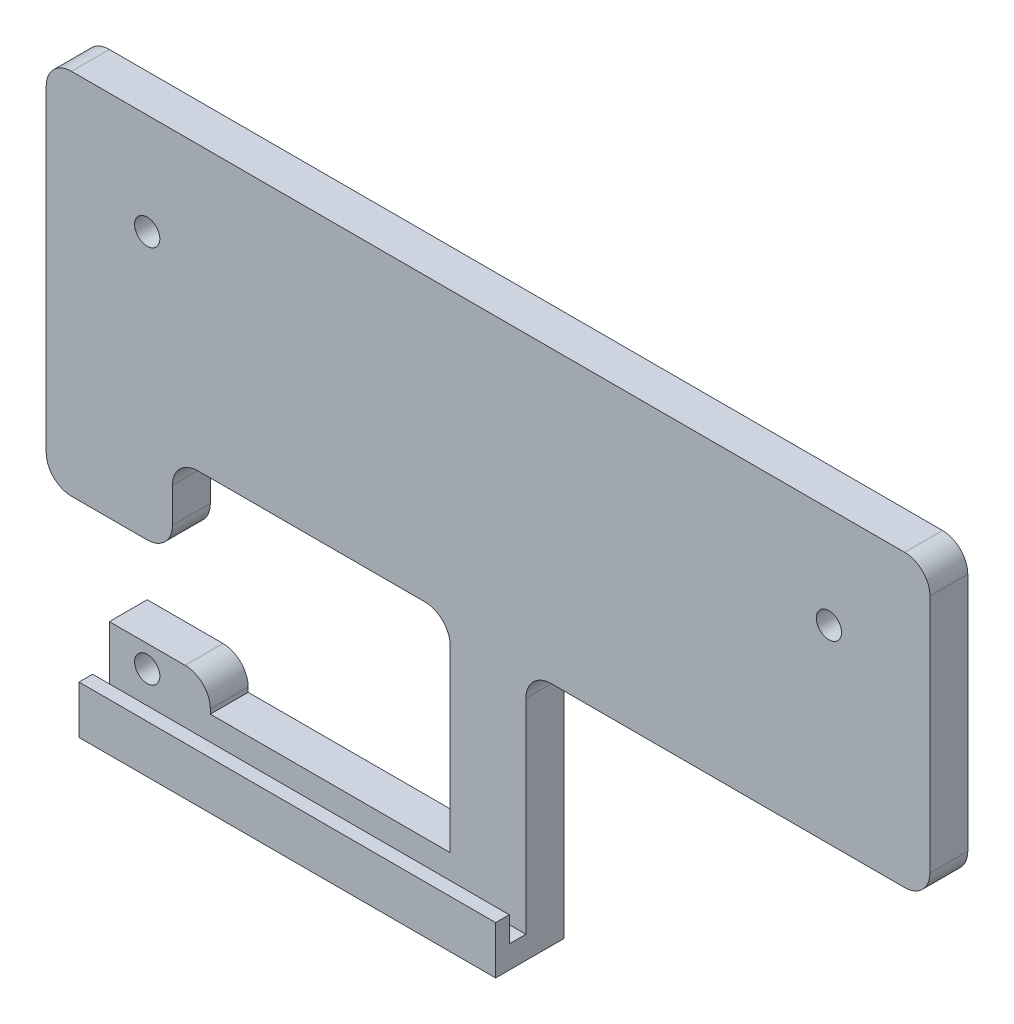
ISO-10303-21;
HEADER;
FILE_DESCRIPTION(('STEP AP214'),'2;1');
FILE_NAME('part.step','',(''),(''),'','','');
FILE_SCHEMA(('AUTOMOTIVE_DESIGN { 1 0 10303 214 1 1 1 1 }'));
ENDSEC;
DATA;
#1=APPLICATION_CONTEXT('core data for automotive mechanical design processes');
#2=APPLICATION_PROTOCOL_DEFINITION('international standard','automotive_design',2000,#1);
#3=PRODUCT_CONTEXT('',#1,'mechanical');
#4=PRODUCT('Part','Part','',(#3));
#5=PRODUCT_RELATED_PRODUCT_CATEGORY('part','',(#4));
#6=PRODUCT_DEFINITION_FORMATION('','',#4);
#7=PRODUCT_DEFINITION_CONTEXT('part definition',#1,'design');
#8=PRODUCT_DEFINITION('design','',#6,#7);
#9=PRODUCT_DEFINITION_SHAPE('','',#8);
#10=(LENGTH_UNIT() NAMED_UNIT(*) SI_UNIT(.MILLI.,.METRE.));
#11=(NAMED_UNIT(*) PLANE_ANGLE_UNIT() SI_UNIT($,.RADIAN.));
#12=(NAMED_UNIT(*) SI_UNIT($,.STERADIAN.) SOLID_ANGLE_UNIT());
#13=UNCERTAINTY_MEASURE_WITH_UNIT(LENGTH_MEASURE(1.E-05),#10,'distance_accuracy_value','');
#14=(GEOMETRIC_REPRESENTATION_CONTEXT(3) GLOBAL_UNCERTAINTY_ASSIGNED_CONTEXT((#13)) GLOBAL_UNIT_ASSIGNED_CONTEXT((#10,
#11,#12)) REPRESENTATION_CONTEXT('',''));
#15=CARTESIAN_POINT('',(0.,0.,0.));
#16=DIRECTION('',(0.,0.,1.));
#17=DIRECTION('',(1.,0.,0.));
#18=AXIS2_PLACEMENT_3D('',#15,#16,#17);
#19=CARTESIAN_POINT('',(-38.1,-23.114,1.397));
#20=DIRECTION('',(0.,-1.,0.));
#21=DIRECTION('',(0.,0.,-1.));
#22=AXIS2_PLACEMENT_3D('',#19,#20,#21);
#23=PLANE('',#22);
#24=DIRECTION('',(-1.,0.,0.));
#25=VECTOR('',#24,1.);
#26=CARTESIAN_POINT('',(3.81000000000001,-23.114,0.0254000000000001));
#27=LINE('',#26,#25);
#28=CARTESIAN_POINT('',(3.81000000000001,-23.114,0.0254000000000001));
#29=VERTEX_POINT('',#28);
#30=CARTESIAN_POINT('',(-38.1,-23.114,0.0254000000000053));
#31=VERTEX_POINT('',#30);
#32=EDGE_CURVE('E406',#29,#31,#27,.T.);
#33=ORIENTED_EDGE('',*,*,#32,.F.);
#34=DIRECTION('',(0.,0.,-1.));
#35=VECTOR('',#34,1.);
#36=CARTESIAN_POINT('',(3.81000000000001,-23.114,1.397));
#37=LINE('',#36,#35);
#38=CARTESIAN_POINT('',(3.81000000000001,-23.114,-1.651));
#39=VERTEX_POINT('',#38);
#40=EDGE_CURVE('E63',#29,#39,#37,.T.);
#41=ORIENTED_EDGE('',*,*,#40,.T.);
#42=DIRECTION('',(-1.,0.,0.));
#43=VECTOR('',#42,1.);
#44=CARTESIAN_POINT('',(-38.1,-23.114,-1.651));
#45=LINE('',#44,#43);
#46=CARTESIAN_POINT('',(-38.1,-23.114,-1.651));
#47=VERTEX_POINT('',#46);
#48=EDGE_CURVE('E432',#39,#47,#45,.T.);
#49=ORIENTED_EDGE('',*,*,#48,.T.);
#50=DIRECTION('',(0.,0.,-1.));
#51=VECTOR('',#50,1.);
#52=CARTESIAN_POINT('',(-38.1,-23.114,1.397));
#53=LINE('',#52,#51);
#54=EDGE_CURVE('E445',#31,#47,#53,.T.);
#55=ORIENTED_EDGE('',*,*,#54,.F.);
#56=EDGE_LOOP('',(#33,#41,#49,#55));
#57=FACE_BOUND('',#56,.T.);
#58=ADVANCED_FACE('F45',(#57),#23,.F.);
#59=CARTESIAN_POINT('',(-27.94,0.,-5.461));
#60=DIRECTION('',(-1.,0.,0.));
#61=DIRECTION('',(0.,0.,1.));
#62=AXIS2_PLACEMENT_3D('',#59,#60,#61);
#63=PLANE('',#62);
#64=DIRECTION('',(0.,-1.,0.));
#65=VECTOR('',#64,1.);
#66=CARTESIAN_POINT('',(-27.94,0.,-1.651));
#67=LINE('',#66,#65);
#68=CARTESIAN_POINT('',(-27.94,-19.3675,-1.651));
#69=VERTEX_POINT('',#68);
#70=CARTESIAN_POINT('',(-27.94,-19.812,-1.651));
#71=VERTEX_POINT('',#70);
#72=EDGE_CURVE('E248',#69,#71,#67,.T.);
#73=ORIENTED_EDGE('',*,*,#72,.T.);
#74=DIRECTION('',(0.,0.,1.));
#75=VECTOR('',#74,1.);
#76=CARTESIAN_POINT('',(-27.94,-19.812,-5.461));
#77=LINE('',#76,#75);
#78=CARTESIAN_POINT('',(-27.94,-19.812,-5.461));
#79=VERTEX_POINT('',#78);
#80=EDGE_CURVE('E11',#79,#71,#77,.T.);
#81=ORIENTED_EDGE('',*,*,#80,.F.);
#82=DIRECTION('',(0.,-1.,0.));
#83=VECTOR('',#82,1.);
#84=CARTESIAN_POINT('',(-27.94,0.,-5.461));
#85=LINE('',#84,#83);
#86=CARTESIAN_POINT('',(-27.94,-19.3675,-5.461));
#87=VERTEX_POINT('',#86);
#88=EDGE_CURVE('E327',#87,#79,#85,.T.);
#89=ORIENTED_EDGE('',*,*,#88,.F.);
#90=DIRECTION('',(0.,0.,1.));
#91=VECTOR('',#90,1.);
#92=CARTESIAN_POINT('',(-27.94,-19.3675,-5.461));
#93=LINE('',#92,#91);
#94=EDGE_CURVE('E72',#87,#69,#93,.T.);
#95=ORIENTED_EDGE('',*,*,#94,.T.);
#96=EDGE_LOOP('',(#73,#81,#89,#95));
#97=FACE_BOUND('',#96,.T.);
#98=ADVANCED_FACE('F47',(#97),#63,.F.);
#99=CARTESIAN_POINT('',(0.,-19.812,-5.461));
#100=DIRECTION('',(0.,-1.,0.));
#101=DIRECTION('',(1.,0.,0.));
#102=AXIS2_PLACEMENT_3D('',#99,#100,#101);
#103=PLANE('',#102);
#104=DIRECTION('',(1.,0.,0.));
#105=VECTOR('',#104,1.);
#106=CARTESIAN_POINT('',(0.,-19.812,-1.651));
#107=LINE('',#106,#105);
#108=CARTESIAN_POINT('',(-3.80999999999999,-19.812,-1.651));
#109=VERTEX_POINT('',#108);
#110=EDGE_CURVE('E251',#71,#109,#107,.T.);
#111=ORIENTED_EDGE('',*,*,#110,.T.);
#112=DIRECTION('',(0.,0.,1.));
#113=VECTOR('',#112,1.);
#114=CARTESIAN_POINT('',(-3.80999999999999,-19.812,-5.461));
#115=LINE('',#114,#113);
#116=CARTESIAN_POINT('',(-3.80999999999999,-19.812,-5.461));
#117=VERTEX_POINT('',#116);
#118=EDGE_CURVE('E55',#117,#109,#115,.T.);
#119=ORIENTED_EDGE('',*,*,#118,.F.);
#120=DIRECTION('',(1.,0.,0.));
#121=VECTOR('',#120,1.);
#122=CARTESIAN_POINT('',(0.,-19.812,-5.461));
#123=LINE('',#122,#121);
#124=EDGE_CURVE('E150',#79,#117,#123,.T.);
#125=ORIENTED_EDGE('',*,*,#124,.F.);
#126=ORIENTED_EDGE('',*,*,#80,.T.);
#127=EDGE_LOOP('',(#111,#119,#125,#126));
#128=FACE_BOUND('',#127,.T.);
#129=ADVANCED_FACE('F560',(#128),#103,.F.);
#130=CARTESIAN_POINT('',(-3.80999999999999,0.,-5.461));
#131=DIRECTION('',(1.,0.,0.));
#132=DIRECTION('',(0.,1.,0.));
#133=AXIS2_PLACEMENT_3D('',#130,#131,#132);
#134=PLANE('',#133);
#135=DIRECTION('',(0.,1.,0.));
#136=VECTOR('',#135,1.);
#137=CARTESIAN_POINT('',(-3.80999999999999,0.,-1.651));
#138=LINE('',#137,#136);
#139=CARTESIAN_POINT('',(-3.80999999999999,-1.778,-1.651));
#140=VERTEX_POINT('',#139);
#141=EDGE_CURVE('E254',#109,#140,#138,.T.);
#142=ORIENTED_EDGE('',*,*,#141,.T.);
#143=DIRECTION('',(0.,0.,1.));
#144=VECTOR('',#143,1.);
#145=CARTESIAN_POINT('',(-3.80999999999999,-1.778,-5.461));
#146=LINE('',#145,#144);
#147=CARTESIAN_POINT('',(-3.80999999999999,-1.778,-5.461));
#148=VERTEX_POINT('',#147);
#149=EDGE_CURVE('E388',#148,#140,#146,.T.);
#150=ORIENTED_EDGE('',*,*,#149,.F.);
#151=DIRECTION('',(0.,1.,0.));
#152=VECTOR('',#151,1.);
#153=CARTESIAN_POINT('',(-3.80999999999999,0.,-5.461));
#154=LINE('',#153,#152);
#155=EDGE_CURVE('E456',#117,#148,#154,.T.);
#156=ORIENTED_EDGE('',*,*,#155,.F.);
#157=ORIENTED_EDGE('',*,*,#118,.T.);
#158=EDGE_LOOP('',(#142,#150,#156,#157));
#159=FACE_BOUND('',#158,.T.);
#160=ADVANCED_FACE('F646',(#159),#134,.F.);
#161=CARTESIAN_POINT('',(-6.34999999999999,-1.778,-5.461));
#162=DIRECTION('',(0.,0.,1.));
#163=DIRECTION('',(1.,0.,0.));
#164=AXIS2_PLACEMENT_3D('',#161,#162,#163);
#165=CYLINDRICAL_SURFACE('',#164,2.54);
#166=CARTESIAN_POINT('',(-6.34999999999999,-1.778,-1.651));
#167=DIRECTION('',(0.,0.,1.));
#168=DIRECTION('',(1.,0.,0.));
#169=AXIS2_PLACEMENT_3D('',#166,#167,#168);
#170=CIRCLE('',#169,2.54);
#171=CARTESIAN_POINT('',(-6.35000000000001,0.762,-1.651));
#172=VERTEX_POINT('',#171);
#173=EDGE_CURVE('E257',#140,#172,#170,.T.);
#174=ORIENTED_EDGE('',*,*,#173,.T.);
#175=DIRECTION('',(0.,0.,1.));
#176=VECTOR('',#175,1.);
#177=CARTESIAN_POINT('',(-6.35000000000001,0.762,-5.461));
#178=LINE('',#177,#176);
#179=CARTESIAN_POINT('',(-6.35000000000001,0.762,-5.461));
#180=VERTEX_POINT('',#179);
#181=EDGE_CURVE('E384',#180,#172,#178,.T.);
#182=ORIENTED_EDGE('',*,*,#181,.F.);
#183=CARTESIAN_POINT('',(-6.34999999999999,-1.778,-5.461));
#184=DIRECTION('',(0.,0.,1.));
#185=DIRECTION('',(1.,0.,0.));
#186=AXIS2_PLACEMENT_3D('',#183,#184,#185);
#187=CIRCLE('',#186,2.54);
#188=EDGE_CURVE('E459',#148,#180,#187,.T.);
#189=ORIENTED_EDGE('',*,*,#188,.F.);
#190=ORIENTED_EDGE('',*,*,#149,.T.);
#191=EDGE_LOOP('',(#174,#182,#189,#190));
#192=FACE_BOUND('',#191,.T.);
#193=ADVANCED_FACE('F642',(#192),#165,.F.);
#194=CARTESIAN_POINT('',(0.,0.762,-5.461));
#195=DIRECTION('',(0.,1.,0.));
#196=DIRECTION('',(-1.,0.,0.));
#197=AXIS2_PLACEMENT_3D('',#194,#195,#196);
#198=PLANE('',#197);
#199=DIRECTION('',(-1.,0.,0.));
#200=VECTOR('',#199,1.);
#201=CARTESIAN_POINT('',(0.,0.762,-1.651));
#202=LINE('',#201,#200);
#203=CARTESIAN_POINT('',(-29.21,0.762000000000001,-1.651));
#204=VERTEX_POINT('',#203);
#205=EDGE_CURVE('E260',#172,#204,#202,.T.);
#206=ORIENTED_EDGE('',*,*,#205,.T.);
#207=DIRECTION('',(0.,0.,1.));
#208=VECTOR('',#207,1.);
#209=CARTESIAN_POINT('',(-29.21,0.762000000000001,-5.461));
#210=LINE('',#209,#208);
#211=CARTESIAN_POINT('',(-29.21,0.762000000000001,-5.461));
#212=VERTEX_POINT('',#211);
#213=EDGE_CURVE('E380',#212,#204,#210,.T.);
#214=ORIENTED_EDGE('',*,*,#213,.F.);
#215=DIRECTION('',(-1.,0.,0.));
#216=VECTOR('',#215,1.);
#217=CARTESIAN_POINT('',(0.,0.762,-5.461));
#218=LINE('',#217,#216);
#219=EDGE_CURVE('E462',#180,#212,#218,.T.);
#220=ORIENTED_EDGE('',*,*,#219,.F.);
#221=ORIENTED_EDGE('',*,*,#181,.T.);
#222=EDGE_LOOP('',(#206,#214,#220,#221));
#223=FACE_BOUND('',#222,.T.);
#224=ADVANCED_FACE('F638',(#223),#198,.F.);
#225=CARTESIAN_POINT('',(-29.21,-1.778,-5.461));
#226=DIRECTION('',(0.,0.,1.));
#227=DIRECTION('',(1.,0.,0.));
#228=AXIS2_PLACEMENT_3D('',#225,#226,#227);
#229=CYLINDRICAL_SURFACE('',#228,2.54);
#230=CARTESIAN_POINT('',(-29.21,-1.778,-1.651));
#231=DIRECTION('',(0.,0.,1.));
#232=DIRECTION('',(1.,0.,0.));
#233=AXIS2_PLACEMENT_3D('',#230,#231,#232);
#234=CIRCLE('',#233,2.54);
#235=CARTESIAN_POINT('',(-31.75,-1.77800000000002,-1.651));
#236=VERTEX_POINT('',#235);
#237=EDGE_CURVE('E263',#204,#236,#234,.T.);
#238=ORIENTED_EDGE('',*,*,#237,.T.);
#239=DIRECTION('',(0.,0.,1.));
#240=VECTOR('',#239,1.);
#241=CARTESIAN_POINT('',(-31.75,-1.77800000000002,-5.461));
#242=LINE('',#241,#240);
#243=CARTESIAN_POINT('',(-31.75,-1.77800000000002,-5.461));
#244=VERTEX_POINT('',#243);
#245=EDGE_CURVE('E377',#244,#236,#242,.T.);
#246=ORIENTED_EDGE('',*,*,#245,.F.);
#247=CARTESIAN_POINT('',(-29.21,-1.778,-5.461));
#248=DIRECTION('',(0.,0.,1.));
#249=DIRECTION('',(1.,0.,0.));
#250=AXIS2_PLACEMENT_3D('',#247,#248,#249);
#251=CIRCLE('',#250,2.54);
#252=EDGE_CURVE('E465',#212,#244,#251,.T.);
#253=ORIENTED_EDGE('',*,*,#252,.F.);
#254=ORIENTED_EDGE('',*,*,#213,.T.);
#255=EDGE_LOOP('',(#238,#246,#253,#254));
#256=FACE_BOUND('',#255,.T.);
#257=ADVANCED_FACE('F634',(#256),#229,.F.);
#258=CARTESIAN_POINT('',(-31.75,0.,-5.461));
#259=DIRECTION('',(1.,0.,0.));
#260=DIRECTION('',(0.,0.,-1.));
#261=AXIS2_PLACEMENT_3D('',#258,#259,#260);
#262=PLANE('',#261);
#263=DIRECTION('',(0.,1.,0.));
#264=VECTOR('',#263,1.);
#265=CARTESIAN_POINT('',(-31.75,0.,-1.651));
#266=LINE('',#265,#264);
#267=CARTESIAN_POINT('',(-31.75,-5.27049999999999,-1.651));
#268=VERTEX_POINT('',#267);
#269=EDGE_CURVE('E267',#268,#236,#266,.T.);
#270=ORIENTED_EDGE('',*,*,#269,.F.);
#271=DIRECTION('',(0.,0.,1.));
#272=VECTOR('',#271,1.);
#273=CARTESIAN_POINT('',(-31.75,-5.27049999999999,-5.461));
#274=LINE('',#273,#272);
#275=CARTESIAN_POINT('',(-31.75,-5.27049999999999,-5.461));
#276=VERTEX_POINT('',#275);
#277=EDGE_CURVE('E374',#276,#268,#274,.T.);
#278=ORIENTED_EDGE('',*,*,#277,.F.);
#279=DIRECTION('',(0.,1.,0.));
#280=VECTOR('',#279,1.);
#281=CARTESIAN_POINT('',(-31.75,0.,-5.461));
#282=LINE('',#281,#280);
#283=EDGE_CURVE('E468',#276,#244,#282,.T.);
#284=ORIENTED_EDGE('',*,*,#283,.T.);
#285=ORIENTED_EDGE('',*,*,#245,.T.);
#286=EDGE_LOOP('',(#270,#278,#284,#285));
#287=FACE_BOUND('',#286,.T.);
#288=ADVANCED_FACE('F630',(#287),#262,.T.);
#289=CARTESIAN_POINT('',(-34.29,-5.27049999999999,-5.461));
#290=DIRECTION('',(0.,0.,1.));
#291=DIRECTION('',(1.,0.,0.));
#292=AXIS2_PLACEMENT_3D('',#289,#290,#291);
#293=CYLINDRICAL_SURFACE('',#292,2.54);
#294=CARTESIAN_POINT('',(-34.29,-5.27049999999999,-1.651));
#295=DIRECTION('',(0.,0.,1.));
#296=DIRECTION('',(1.,0.,0.));
#297=AXIS2_PLACEMENT_3D('',#294,#295,#296);
#298=CIRCLE('',#297,2.54);
#299=CARTESIAN_POINT('',(-34.29,-7.81049999999999,-1.651));
#300=VERTEX_POINT('',#299);
#301=EDGE_CURVE('E271',#300,#268,#298,.T.);
#302=ORIENTED_EDGE('',*,*,#301,.F.);
#303=DIRECTION('',(0.,0.,1.));
#304=VECTOR('',#303,1.);
#305=CARTESIAN_POINT('',(-34.29,-7.81049999999999,-5.461));
#306=LINE('',#305,#304);
#307=CARTESIAN_POINT('',(-34.29,-7.81049999999999,-5.461));
#308=VERTEX_POINT('',#307);
#309=EDGE_CURVE('E371',#308,#300,#306,.T.);
#310=ORIENTED_EDGE('',*,*,#309,.F.);
#311=CARTESIAN_POINT('',(-34.29,-5.27049999999999,-5.461));
#312=DIRECTION('',(0.,0.,1.));
#313=DIRECTION('',(1.,0.,0.));
#314=AXIS2_PLACEMENT_3D('',#311,#312,#313);
#315=CIRCLE('',#314,2.54);
#316=EDGE_CURVE('E472',#308,#276,#315,.T.);
#317=ORIENTED_EDGE('',*,*,#316,.T.);
#318=ORIENTED_EDGE('',*,*,#277,.T.);
#319=EDGE_LOOP('',(#302,#310,#317,#318));
#320=FACE_BOUND('',#319,.T.);
#321=ADVANCED_FACE('F626',(#320),#293,.T.);
#322=CARTESIAN_POINT('',(0.,-7.8105,-5.461));
#323=DIRECTION('',(0.,-1.,0.));
#324=DIRECTION('',(1.,0.,0.));
#325=AXIS2_PLACEMENT_3D('',#322,#323,#324);
#326=PLANE('',#325);
#327=DIRECTION('',(1.,0.,0.));
#328=VECTOR('',#327,1.);
#329=CARTESIAN_POINT('',(0.,-7.8105,-1.651));
#330=LINE('',#329,#328);
#331=CARTESIAN_POINT('',(-41.91,-7.81049999999999,-1.651));
#332=VERTEX_POINT('',#331);
#333=EDGE_CURVE('E275',#332,#300,#330,.T.);
#334=ORIENTED_EDGE('',*,*,#333,.F.);
#335=DIRECTION('',(0.,0.,1.));
#336=VECTOR('',#335,1.);
#337=CARTESIAN_POINT('',(-41.91,-7.81049999999999,-5.461));
#338=LINE('',#337,#336);
#339=CARTESIAN_POINT('',(-41.91,-7.81049999999999,-5.461));
#340=VERTEX_POINT('',#339);
#341=EDGE_CURVE('E368',#340,#332,#338,.T.);
#342=ORIENTED_EDGE('',*,*,#341,.F.);
#343=DIRECTION('',(1.,0.,0.));
#344=VECTOR('',#343,1.);
#345=CARTESIAN_POINT('',(0.,-7.8105,-5.461));
#346=LINE('',#345,#344);
#347=EDGE_CURVE('E476',#340,#308,#346,.T.);
#348=ORIENTED_EDGE('',*,*,#347,.T.);
#349=ORIENTED_EDGE('',*,*,#309,.T.);
#350=EDGE_LOOP('',(#334,#342,#348,#349));
#351=FACE_BOUND('',#350,.T.);
#352=ADVANCED_FACE('F622',(#351),#326,.T.);
#353=CARTESIAN_POINT('',(-41.91,-5.27049999999999,-5.461));
#354=DIRECTION('',(0.,0.,1.));
#355=DIRECTION('',(1.,0.,0.));
#356=AXIS2_PLACEMENT_3D('',#353,#354,#355);
#357=CYLINDRICAL_SURFACE('',#356,2.54);
#358=CARTESIAN_POINT('',(-41.91,-5.27049999999999,-1.651));
#359=DIRECTION('',(0.,0.,1.));
#360=DIRECTION('',(1.,0.,0.));
#361=AXIS2_PLACEMENT_3D('',#358,#359,#360);
#362=CIRCLE('',#361,2.54);
#363=CARTESIAN_POINT('',(-44.45,-5.27049999999997,-1.651));
#364=VERTEX_POINT('',#363);
#365=EDGE_CURVE('E279',#364,#332,#362,.T.);
#366=ORIENTED_EDGE('',*,*,#365,.F.);
#367=DIRECTION('',(0.,0.,1.));
#368=VECTOR('',#367,1.);
#369=CARTESIAN_POINT('',(-44.45,-5.27049999999997,-5.461));
#370=LINE('',#369,#368);
#371=CARTESIAN_POINT('',(-44.45,-5.27049999999997,-5.461));
#372=VERTEX_POINT('',#371);
#373=EDGE_CURVE('E365',#372,#364,#370,.T.);
#374=ORIENTED_EDGE('',*,*,#373,.F.);
#375=CARTESIAN_POINT('',(-41.91,-5.27049999999999,-5.461));
#376=DIRECTION('',(0.,0.,1.));
#377=DIRECTION('',(1.,0.,0.));
#378=AXIS2_PLACEMENT_3D('',#375,#376,#377);
#379=CIRCLE('',#378,2.54);
#380=EDGE_CURVE('E480',#372,#340,#379,.T.);
#381=ORIENTED_EDGE('',*,*,#380,.T.);
#382=ORIENTED_EDGE('',*,*,#341,.T.);
#383=EDGE_LOOP('',(#366,#374,#381,#382));
#384=FACE_BOUND('',#383,.T.);
#385=ADVANCED_FACE('F618',(#384),#357,.T.);
#386=CARTESIAN_POINT('',(-44.45,0.,-5.461));
#387=DIRECTION('',(-1.,0.,0.));
#388=DIRECTION('',(0.,0.,1.));
#389=AXIS2_PLACEMENT_3D('',#386,#387,#388);
#390=PLANE('',#389);
#391=DIRECTION('',(0.,-1.,0.));
#392=VECTOR('',#391,1.);
#393=CARTESIAN_POINT('',(-44.45,0.,-1.651));
#394=LINE('',#393,#392);
#395=CARTESIAN_POINT('',(-44.45,26.67,-1.651));
#396=VERTEX_POINT('',#395);
#397=EDGE_CURVE('E283',#396,#364,#394,.T.);
#398=ORIENTED_EDGE('',*,*,#397,.F.);
#399=DIRECTION('',(0.,0.,1.));
#400=VECTOR('',#399,1.);
#401=CARTESIAN_POINT('',(-44.45,26.67,-5.461));
#402=LINE('',#401,#400);
#403=CARTESIAN_POINT('',(-44.45,26.67,-5.461));
#404=VERTEX_POINT('',#403);
#405=EDGE_CURVE('E362',#404,#396,#402,.T.);
#406=ORIENTED_EDGE('',*,*,#405,.F.);
#407=DIRECTION('',(0.,-1.,0.));
#408=VECTOR('',#407,1.);
#409=CARTESIAN_POINT('',(-44.45,0.,-5.461));
#410=LINE('',#409,#408);
#411=EDGE_CURVE('E484',#404,#372,#410,.T.);
#412=ORIENTED_EDGE('',*,*,#411,.T.);
#413=ORIENTED_EDGE('',*,*,#373,.T.);
#414=EDGE_LOOP('',(#398,#406,#412,#413));
#415=FACE_BOUND('',#414,.T.);
#416=ADVANCED_FACE('F614',(#415),#390,.T.);
#417=CARTESIAN_POINT('',(-41.91,26.67,-5.461));
#418=DIRECTION('',(0.,0.,1.));
#419=DIRECTION('',(1.,0.,0.));
#420=AXIS2_PLACEMENT_3D('',#417,#418,#419);
#421=CYLINDRICAL_SURFACE('',#420,2.54);
#422=CARTESIAN_POINT('',(-41.91,26.67,-1.651));
#423=DIRECTION('',(0.,0.,1.));
#424=DIRECTION('',(1.,0.,0.));
#425=AXIS2_PLACEMENT_3D('',#422,#423,#424);
#426=CIRCLE('',#425,2.54);
#427=CARTESIAN_POINT('',(-41.91,29.21,-1.651));
#428=VERTEX_POINT('',#427);
#429=EDGE_CURVE('E287',#428,#396,#426,.T.);
#430=ORIENTED_EDGE('',*,*,#429,.F.);
#431=DIRECTION('',(0.,0.,1.));
#432=VECTOR('',#431,1.);
#433=CARTESIAN_POINT('',(-41.91,29.21,-5.461));
#434=LINE('',#433,#432);
#435=CARTESIAN_POINT('',(-41.91,29.21,-5.461));
#436=VERTEX_POINT('',#435);
#437=EDGE_CURVE('E359',#436,#428,#434,.T.);
#438=ORIENTED_EDGE('',*,*,#437,.F.);
#439=CARTESIAN_POINT('',(-41.91,26.67,-5.461));
#440=DIRECTION('',(0.,0.,1.));
#441=DIRECTION('',(1.,0.,0.));
#442=AXIS2_PLACEMENT_3D('',#439,#440,#441);
#443=CIRCLE('',#442,2.54);
#444=EDGE_CURVE('E488',#436,#404,#443,.T.);
#445=ORIENTED_EDGE('',*,*,#444,.T.);
#446=ORIENTED_EDGE('',*,*,#405,.T.);
#447=EDGE_LOOP('',(#430,#438,#445,#446));
#448=FACE_BOUND('',#447,.T.);
#449=ADVANCED_FACE('F610',(#448),#421,.T.);
#450=CARTESIAN_POINT('',(0.,29.21,-5.461));
#451=DIRECTION('',(0.,1.,0.));
#452=DIRECTION('',(0.,0.,1.));
#453=AXIS2_PLACEMENT_3D('',#450,#451,#452);
#454=PLANE('',#453);
#455=DIRECTION('',(-1.,0.,0.));
#456=VECTOR('',#455,1.);
#457=CARTESIAN_POINT('',(0.,29.21,-1.651));
#458=LINE('',#457,#456);
#459=CARTESIAN_POINT('',(41.91,29.21,-1.651));
#460=VERTEX_POINT('',#459);
#461=EDGE_CURVE('E291',#460,#428,#458,.T.);
#462=ORIENTED_EDGE('',*,*,#461,.F.);
#463=DIRECTION('',(0.,0.,1.));
#464=VECTOR('',#463,1.);
#465=CARTESIAN_POINT('',(41.91,29.21,-5.461));
#466=LINE('',#465,#464);
#467=CARTESIAN_POINT('',(41.91,29.21,-5.461));
#468=VERTEX_POINT('',#467);
#469=EDGE_CURVE('E356',#468,#460,#466,.T.);
#470=ORIENTED_EDGE('',*,*,#469,.F.);
#471=DIRECTION('',(-1.,0.,0.));
#472=VECTOR('',#471,1.);
#473=CARTESIAN_POINT('',(0.,29.21,-5.461));
#474=LINE('',#473,#472);
#475=EDGE_CURVE('E492',#468,#436,#474,.T.);
#476=ORIENTED_EDGE('',*,*,#475,.T.);
#477=ORIENTED_EDGE('',*,*,#437,.T.);
#478=EDGE_LOOP('',(#462,#470,#476,#477));
#479=FACE_BOUND('',#478,.T.);
#480=ADVANCED_FACE('F606',(#479),#454,.T.);
#481=CARTESIAN_POINT('',(41.91,26.67,-5.461));
#482=DIRECTION('',(0.,0.,1.));
#483=DIRECTION('',(1.,0.,0.));
#484=AXIS2_PLACEMENT_3D('',#481,#482,#483);
#485=CYLINDRICAL_SURFACE('',#484,2.54);
#486=CARTESIAN_POINT('',(41.91,26.67,-1.651));
#487=DIRECTION('',(0.,0.,1.));
#488=DIRECTION('',(1.,0.,0.));
#489=AXIS2_PLACEMENT_3D('',#486,#487,#488);
#490=CIRCLE('',#489,2.54);
#491=CARTESIAN_POINT('',(44.45,26.67,-1.651));
#492=VERTEX_POINT('',#491);
#493=EDGE_CURVE('E295',#492,#460,#490,.T.);
#494=ORIENTED_EDGE('',*,*,#493,.F.);
#495=DIRECTION('',(0.,0.,1.));
#496=VECTOR('',#495,1.);
#497=CARTESIAN_POINT('',(44.45,26.67,-5.461));
#498=LINE('',#497,#496);
#499=CARTESIAN_POINT('',(44.45,26.67,-5.461));
#500=VERTEX_POINT('',#499);
#501=EDGE_CURVE('E352',#500,#492,#498,.T.);
#502=ORIENTED_EDGE('',*,*,#501,.F.);
#503=CARTESIAN_POINT('',(41.91,26.67,-5.461));
#504=DIRECTION('',(0.,0.,1.));
#505=DIRECTION('',(1.,0.,0.));
#506=AXIS2_PLACEMENT_3D('',#503,#504,#505);
#507=CIRCLE('',#506,2.54);
#508=EDGE_CURVE('E496',#500,#468,#507,.T.);
#509=ORIENTED_EDGE('',*,*,#508,.T.);
#510=ORIENTED_EDGE('',*,*,#469,.T.);
#511=EDGE_LOOP('',(#494,#502,#509,#510));
#512=FACE_BOUND('',#511,.T.);
#513=ADVANCED_FACE('F602',(#512),#485,.T.);
#514=CARTESIAN_POINT('',(44.45,0.,-5.461));
#515=DIRECTION('',(-1.,0.,0.));
#516=DIRECTION('',(0.,0.,1.));
#517=AXIS2_PLACEMENT_3D('',#514,#515,#516);
#518=PLANE('',#517);
#519=DIRECTION('',(0.,-1.,0.));
#520=VECTOR('',#519,1.);
#521=CARTESIAN_POINT('',(44.45,0.,-1.651));
#522=LINE('',#521,#520);
#523=CARTESIAN_POINT('',(44.45,2.54,-1.651));
#524=VERTEX_POINT('',#523);
#525=EDGE_CURVE('E299',#492,#524,#522,.T.);
#526=ORIENTED_EDGE('',*,*,#525,.T.);
#527=DIRECTION('',(0.,0.,1.));
#528=VECTOR('',#527,1.);
#529=CARTESIAN_POINT('',(44.45,2.54,-5.461));
#530=LINE('',#529,#528);
#531=CARTESIAN_POINT('',(44.45,2.54,-5.461));
#532=VERTEX_POINT('',#531);
#533=EDGE_CURVE('E349',#532,#524,#530,.T.);
#534=ORIENTED_EDGE('',*,*,#533,.F.);
#535=DIRECTION('',(0.,-1.,0.));
#536=VECTOR('',#535,1.);
#537=CARTESIAN_POINT('',(44.45,0.,-5.461));
#538=LINE('',#537,#536);
#539=EDGE_CURVE('E500',#500,#532,#538,.T.);
#540=ORIENTED_EDGE('',*,*,#539,.F.);
#541=ORIENTED_EDGE('',*,*,#501,.T.);
#542=EDGE_LOOP('',(#526,#534,#540,#541));
#543=FACE_BOUND('',#542,.T.);
#544=ADVANCED_FACE('F598',(#543),#518,.F.);
#545=CARTESIAN_POINT('',(41.91,2.54,-5.461));
#546=DIRECTION('',(0.,0.,1.));
#547=DIRECTION('',(1.,0.,0.));
#548=AXIS2_PLACEMENT_3D('',#545,#546,#547);
#549=CYLINDRICAL_SURFACE('',#548,2.54);
#550=CARTESIAN_POINT('',(41.91,2.54,-1.651));
#551=DIRECTION('',(0.,0.,1.));
#552=DIRECTION('',(1.,0.,0.));
#553=AXIS2_PLACEMENT_3D('',#550,#551,#552);
#554=CIRCLE('',#553,2.54);
#555=CARTESIAN_POINT('',(41.91,0.,-1.651));
#556=VERTEX_POINT('',#555);
#557=EDGE_CURVE('E303',#556,#524,#554,.T.);
#558=ORIENTED_EDGE('',*,*,#557,.F.);
#559=DIRECTION('',(0.,0.,1.));
#560=VECTOR('',#559,1.);
#561=CARTESIAN_POINT('',(41.91,0.,-5.461));
#562=LINE('',#561,#560);
#563=CARTESIAN_POINT('',(41.91,0.,-5.461));
#564=VERTEX_POINT('',#563);
#565=EDGE_CURVE('E346',#564,#556,#562,.T.);
#566=ORIENTED_EDGE('',*,*,#565,.F.);
#567=CARTESIAN_POINT('',(41.91,2.54,-5.461));
#568=DIRECTION('',(0.,0.,1.));
#569=DIRECTION('',(1.,0.,0.));
#570=AXIS2_PLACEMENT_3D('',#567,#568,#569);
#571=CIRCLE('',#570,2.54);
#572=EDGE_CURVE('E503',#564,#532,#571,.T.);
#573=ORIENTED_EDGE('',*,*,#572,.T.);
#574=ORIENTED_EDGE('',*,*,#533,.T.);
#575=EDGE_LOOP('',(#558,#566,#573,#574));
#576=FACE_BOUND('',#575,.T.);
#577=ADVANCED_FACE('F594',(#576),#549,.T.);
#578=CARTESIAN_POINT('',(0.,0.,-5.461));
#579=DIRECTION('',(0.,1.,0.));
#580=DIRECTION('',(0.,0.,1.));
#581=AXIS2_PLACEMENT_3D('',#578,#579,#580);
#582=PLANE('',#581);
#583=DIRECTION('',(-1.,0.,0.));
#584=VECTOR('',#583,1.);
#585=CARTESIAN_POINT('',(0.,0.,-1.651));
#586=LINE('',#585,#584);
#587=CARTESIAN_POINT('',(6.35000000000003,0.,-1.651));
#588=VERTEX_POINT('',#587);
#589=EDGE_CURVE('E307',#556,#588,#586,.T.);
#590=ORIENTED_EDGE('',*,*,#589,.T.);
#591=DIRECTION('',(0.,0.,1.));
#592=VECTOR('',#591,1.);
#593=CARTESIAN_POINT('',(6.35000000000003,0.,-5.461));
#594=LINE('',#593,#592);
#595=CARTESIAN_POINT('',(6.35000000000003,0.,-5.461));
#596=VERTEX_POINT('',#595);
#597=EDGE_CURVE('E342',#596,#588,#594,.T.);
#598=ORIENTED_EDGE('',*,*,#597,.F.);
#599=DIRECTION('',(-1.,0.,0.));
#600=VECTOR('',#599,1.);
#601=CARTESIAN_POINT('',(0.,0.,-5.461));
#602=LINE('',#601,#600);
#603=EDGE_CURVE('E507',#564,#596,#602,.T.);
#604=ORIENTED_EDGE('',*,*,#603,.F.);
#605=ORIENTED_EDGE('',*,*,#565,.T.);
#606=EDGE_LOOP('',(#590,#598,#604,#605));
#607=FACE_BOUND('',#606,.T.);
#608=ADVANCED_FACE('F590',(#607),#582,.F.);
#609=CARTESIAN_POINT('',(6.35000000000001,-2.54,-5.461));
#610=DIRECTION('',(0.,0.,1.));
#611=DIRECTION('',(1.,0.,0.));
#612=AXIS2_PLACEMENT_3D('',#609,#610,#611);
#613=CYLINDRICAL_SURFACE('',#612,2.54);
#614=CARTESIAN_POINT('',(6.35000000000001,-2.54,-1.651));
#615=DIRECTION('',(0.,0.,1.));
#616=DIRECTION('',(1.,0.,0.));
#617=AXIS2_PLACEMENT_3D('',#614,#615,#616);
#618=CIRCLE('',#617,2.54);
#619=CARTESIAN_POINT('',(3.81000000000001,-2.54000000000002,-1.651));
#620=VERTEX_POINT('',#619);
#621=EDGE_CURVE('E310',#588,#620,#618,.T.);
#622=ORIENTED_EDGE('',*,*,#621,.T.);
#623=DIRECTION('',(0.,0.,1.));
#624=VECTOR('',#623,1.);
#625=CARTESIAN_POINT('',(3.81000000000001,-2.54000000000002,-5.461));
#626=LINE('',#625,#624);
#627=CARTESIAN_POINT('',(3.81000000000001,-2.54000000000002,-5.461));
#628=VERTEX_POINT('',#627);
#629=EDGE_CURVE('E338',#628,#620,#626,.T.);
#630=ORIENTED_EDGE('',*,*,#629,.F.);
#631=CARTESIAN_POINT('',(6.35000000000001,-2.54,-5.461));
#632=DIRECTION('',(0.,0.,1.));
#633=DIRECTION('',(1.,0.,0.));
#634=AXIS2_PLACEMENT_3D('',#631,#632,#633);
#635=CIRCLE('',#634,2.54);
#636=EDGE_CURVE('E510',#596,#628,#635,.T.);
#637=ORIENTED_EDGE('',*,*,#636,.F.);
#638=ORIENTED_EDGE('',*,*,#597,.T.);
#639=EDGE_LOOP('',(#622,#630,#637,#638));
#640=FACE_BOUND('',#639,.T.);
#641=ADVANCED_FACE('F586',(#640),#613,.F.);
#642=CARTESIAN_POINT('',(3.80999999999999,0.,-5.461));
#643=DIRECTION('',(-1.,0.,0.));
#644=DIRECTION('',(0.,-1.,0.));
#645=AXIS2_PLACEMENT_3D('',#642,#643,#644);
#646=PLANE('',#645);
#647=DIRECTION('',(0.,-1.,0.));
#648=VECTOR('',#647,1.);
#649=CARTESIAN_POINT('',(3.80999999999999,0.,-1.651));
#650=LINE('',#649,#648);
#651=EDGE_CURVE('E314',#620,#39,#650,.T.);
#652=ORIENTED_EDGE('',*,*,#651,.T.);
#653=ORIENTED_EDGE('',*,*,#40,.F.);
#654=DIRECTION('',(0.,-1.,0.));
#655=VECTOR('',#654,1.);
#656=CARTESIAN_POINT('',(3.81000000000001,-20.574,0.0254000000000001));
#657=LINE('',#656,#655);
#658=CARTESIAN_POINT('',(3.81000000000001,-20.574,0.0254000000000001));
#659=VERTEX_POINT('',#658);
#660=EDGE_CURVE('E429',#659,#29,#657,.T.);
#661=ORIENTED_EDGE('',*,*,#660,.F.);
#662=DIRECTION('',(0.,0.,-1.));
#663=VECTOR('',#662,1.);
#664=CARTESIAN_POINT('',(3.81000000000001,-20.574,1.397));
#665=LINE('',#664,#663);
#666=CARTESIAN_POINT('',(3.81000000000001,-20.574,1.397));
#667=VERTEX_POINT('',#666);
#668=EDGE_CURVE('E411',#667,#659,#665,.T.);
#669=ORIENTED_EDGE('',*,*,#668,.F.);
#670=DIRECTION('',(0.,1.,0.));
#671=VECTOR('',#670,1.);
#672=CARTESIAN_POINT('',(3.81000000000001,-23.114,1.397));
#673=LINE('',#672,#671);
#674=CARTESIAN_POINT('',(3.81000000000001,-25.4,1.397));
#675=VERTEX_POINT('',#674);
#676=EDGE_CURVE('E441',#675,#667,#673,.T.);
#677=ORIENTED_EDGE('',*,*,#676,.F.);
#678=DIRECTION('',(0.,0.,1.));
#679=VECTOR('',#678,1.);
#680=CARTESIAN_POINT('',(3.81000000000001,-25.4,-5.461));
#681=LINE('',#680,#679);
#682=CARTESIAN_POINT('',(3.81000000000001,-25.4,-5.461));
#683=VERTEX_POINT('',#682);
#684=EDGE_CURVE('E334',#683,#675,#681,.T.);
#685=ORIENTED_EDGE('',*,*,#684,.F.);
#686=DIRECTION('',(0.,-1.,0.));
#687=VECTOR('',#686,1.);
#688=CARTESIAN_POINT('',(3.81000000000001,0.,-5.461));
#689=LINE('',#688,#687);
#690=EDGE_CURVE('E513',#628,#683,#689,.T.);
#691=ORIENTED_EDGE('',*,*,#690,.F.);
#692=ORIENTED_EDGE('',*,*,#629,.T.);
#693=EDGE_LOOP('',(#652,#653,#661,#669,#677,#685,#691,#692));
#694=FACE_BOUND('',#693,.T.);
#695=ADVANCED_FACE('F582',(#694),#646,.F.);
#696=CARTESIAN_POINT('',(0.,-25.4,-5.461));
#697=DIRECTION('',(0.,1.,0.));
#698=DIRECTION('',(0.,0.,1.));
#699=AXIS2_PLACEMENT_3D('',#696,#697,#698);
#700=PLANE('',#699);
#701=ORIENTED_EDGE('',*,*,#684,.T.);
#702=DIRECTION('',(1.,0.,0.));
#703=VECTOR('',#702,1.);
#704=CARTESIAN_POINT('',(3.81000000000001,-25.4,1.397));
#705=LINE('',#704,#703);
#706=CARTESIAN_POINT('',(-38.1,-25.4,1.397));
#707=VERTEX_POINT('',#706);
#708=EDGE_CURVE('E437',#707,#675,#705,.T.);
#709=ORIENTED_EDGE('',*,*,#708,.F.);
#710=DIRECTION('',(0.,0.,1.));
#711=VECTOR('',#710,1.);
#712=CARTESIAN_POINT('',(-38.1,-25.4,-5.461));
#713=LINE('',#712,#711);
#714=CARTESIAN_POINT('',(-38.1,-25.4,-5.461));
#715=VERTEX_POINT('',#714);
#716=EDGE_CURVE('E237',#715,#707,#713,.T.);
#717=ORIENTED_EDGE('',*,*,#716,.F.);
#718=DIRECTION('',(-1.,0.,0.));
#719=VECTOR('',#718,1.);
#720=CARTESIAN_POINT('',(0.,-25.4,-5.461));
#721=LINE('',#720,#719);
#722=EDGE_CURVE('E221',#683,#715,#721,.T.);
#723=ORIENTED_EDGE('',*,*,#722,.F.);
#724=EDGE_LOOP('',(#701,#709,#717,#723));
#725=FACE_BOUND('',#724,.T.);
#726=ADVANCED_FACE('F579',(#725),#700,.F.);
#727=CARTESIAN_POINT('',(-38.1,0.,-5.461));
#728=DIRECTION('',(1.,0.,0.));
#729=DIRECTION('',(0.,0.,-1.));
#730=AXIS2_PLACEMENT_3D('',#727,#728,#729);
#731=PLANE('',#730);
#732=ORIENTED_EDGE('',*,*,#716,.T.);
#733=DIRECTION('',(0.,-1.,0.));
#734=VECTOR('',#733,1.);
#735=CARTESIAN_POINT('',(-38.1,-25.4,1.397));
#736=LINE('',#735,#734);
#737=CARTESIAN_POINT('',(-38.1,-20.574,1.397));
#738=VERTEX_POINT('',#737);
#739=EDGE_CURVE('E433',#738,#707,#736,.T.);
#740=ORIENTED_EDGE('',*,*,#739,.F.);
#741=DIRECTION('',(0.,0.,1.));
#742=VECTOR('',#741,1.);
#743=CARTESIAN_POINT('',(-38.1,-20.574,0.0254000000000053));
#744=LINE('',#743,#742);
#745=CARTESIAN_POINT('',(-38.1,-20.574,0.0254000000000053));
#746=VERTEX_POINT('',#745);
#747=EDGE_CURVE('E519',#746,#738,#744,.T.);
#748=ORIENTED_EDGE('',*,*,#747,.F.);
#749=DIRECTION('',(0.,-1.,0.));
#750=VECTOR('',#749,1.);
#751=CARTESIAN_POINT('',(-38.1,-20.574,0.0254000000000053));
#752=LINE('',#751,#750);
#753=EDGE_CURVE('E426',#746,#31,#752,.T.);
#754=ORIENTED_EDGE('',*,*,#753,.T.);
#755=ORIENTED_EDGE('',*,*,#54,.T.);
#756=DIRECTION('',(0.,1.,0.));
#757=VECTOR('',#756,1.);
#758=CARTESIAN_POINT('',(-38.1,0.,-1.651));
#759=LINE('',#758,#757);
#760=CARTESIAN_POINT('',(-38.1,-16.8275,-1.651));
#761=VERTEX_POINT('',#760);
#762=EDGE_CURVE('E232',#47,#761,#759,.T.);
#763=ORIENTED_EDGE('',*,*,#762,.T.);
#764=DIRECTION('',(0.,0.,1.));
#765=VECTOR('',#764,1.);
#766=CARTESIAN_POINT('',(-38.1,-16.8275,-5.461));
#767=LINE('',#766,#765);
#768=CARTESIAN_POINT('',(-38.1,-16.8275,-5.461));
#769=VERTEX_POINT('',#768);
#770=EDGE_CURVE('E228',#769,#761,#767,.T.);
#771=ORIENTED_EDGE('',*,*,#770,.F.);
#772=DIRECTION('',(0.,1.,0.));
#773=VECTOR('',#772,1.);
#774=CARTESIAN_POINT('',(-38.0999999999999,1.04083408558608E-13,-5.461));
#775=LINE('',#774,#773);
#776=EDGE_CURVE('E213',#715,#769,#775,.T.);
#777=ORIENTED_EDGE('',*,*,#776,.F.);
#778=EDGE_LOOP('',(#732,#740,#748,#754,#755,#763,#771,#777));
#779=FACE_BOUND('',#778,.T.);
#780=ADVANCED_FACE('F229',(#779),#731,.F.);
#781=CARTESIAN_POINT('',(0.,-16.8275,-5.461));
#782=DIRECTION('',(0.,-1.,0.));
#783=DIRECTION('',(0.,0.,-1.));
#784=AXIS2_PLACEMENT_3D('',#781,#782,#783);
#785=PLANE('',#784);
#786=DIRECTION('',(1.,0.,0.));
#787=VECTOR('',#786,1.);
#788=CARTESIAN_POINT('',(0.,-16.8275,-1.651));
#789=LINE('',#788,#787);
#790=CARTESIAN_POINT('',(-30.48,-16.8275,-1.651));
#791=VERTEX_POINT('',#790);
#792=EDGE_CURVE('E320',#761,#791,#789,.T.);
#793=ORIENTED_EDGE('',*,*,#792,.T.);
#794=DIRECTION('',(0.,0.,1.));
#795=VECTOR('',#794,1.);
#796=CARTESIAN_POINT('',(-30.48,-16.8275,-5.461));
#797=LINE('',#796,#795);
#798=CARTESIAN_POINT('',(-30.48,-16.8275,-5.461));
#799=VERTEX_POINT('',#798);
#800=EDGE_CURVE('E238',#799,#791,#797,.T.);
#801=ORIENTED_EDGE('',*,*,#800,.F.);
#802=DIRECTION('',(1.,0.,0.));
#803=VECTOR('',#802,1.);
#804=CARTESIAN_POINT('',(0.,-16.8275,-5.461));
#805=LINE('',#804,#803);
#806=EDGE_CURVE('E218',#769,#799,#805,.T.);
#807=ORIENTED_EDGE('',*,*,#806,.F.);
#808=ORIENTED_EDGE('',*,*,#770,.T.);
#809=EDGE_LOOP('',(#793,#801,#807,#808));
#810=FACE_BOUND('',#809,.T.);
#811=ADVANCED_FACE('F240',(#810),#785,.F.);
#812=CARTESIAN_POINT('',(-30.48,-19.3675,-5.461));
#813=DIRECTION('',(0.,0.,1.));
#814=DIRECTION('',(1.,0.,0.));
#815=AXIS2_PLACEMENT_3D('',#812,#813,#814);
#816=CYLINDRICAL_SURFACE('',#815,2.54);
#817=CARTESIAN_POINT('',(-30.48,-19.3675,-1.651));
#818=DIRECTION('',(0.,0.,1.));
#819=DIRECTION('',(1.,0.,0.));
#820=AXIS2_PLACEMENT_3D('',#817,#818,#819);
#821=CIRCLE('',#820,2.54);
#822=EDGE_CURVE('E323',#69,#791,#821,.T.);
#823=ORIENTED_EDGE('',*,*,#822,.F.);
#824=ORIENTED_EDGE('',*,*,#94,.F.);
#825=CARTESIAN_POINT('',(-30.48,-19.3675,-5.461));
#826=DIRECTION('',(0.,0.,1.));
#827=DIRECTION('',(1.,0.,0.));
#828=AXIS2_PLACEMENT_3D('',#825,#826,#827);
#829=CIRCLE('',#828,2.54);
#830=EDGE_CURVE('E242',#87,#799,#829,.T.);
#831=ORIENTED_EDGE('',*,*,#830,.T.);
#832=ORIENTED_EDGE('',*,*,#800,.T.);
#833=EDGE_LOOP('',(#823,#824,#831,#832));
#834=FACE_BOUND('',#833,.T.);
#835=ADVANCED_FACE('F568',(#834),#816,.T.);
#836=CARTESIAN_POINT('',(-6.34999999999999,-1.778,-5.461));
#837=DIRECTION('',(0.,0.,1.));
#838=DIRECTION('',(1.,0.,0.));
#839=AXIS2_PLACEMENT_3D('',#836,#837,#838);
#840=PLANE('',#839);
#841=CARTESIAN_POINT('',(-34.29,-19.05,-5.461));
#842=DIRECTION('',(0.,0.,1.));
#843=DIRECTION('',(1.,0.,0.));
#844=AXIS2_PLACEMENT_3D('',#841,#842,#843);
#845=CIRCLE('',#844,1.27);
#846=CARTESIAN_POINT('',(-33.02,-19.05,-5.461));
#847=VERTEX_POINT('',#846);
#848=EDGE_CURVE('E532',#847,#847,#845,.T.);
#849=ORIENTED_EDGE('',*,*,#848,.T.);
#850=EDGE_LOOP('',(#849));
#851=FACE_BOUND('',#850,.T.);
#852=CARTESIAN_POINT('',(34.29,19.05,-5.461));
#853=DIRECTION('',(0.,0.,1.));
#854=DIRECTION('',(1.,0.,0.));
#855=AXIS2_PLACEMENT_3D('',#852,#853,#854);
#856=CIRCLE('',#855,1.27);
#857=CARTESIAN_POINT('',(35.56,19.05,-5.461));
#858=VERTEX_POINT('',#857);
#859=EDGE_CURVE('E531',#858,#858,#856,.T.);
#860=ORIENTED_EDGE('',*,*,#859,.T.);
#861=EDGE_LOOP('',(#860));
#862=FACE_BOUND('',#861,.T.);
#863=CARTESIAN_POINT('',(-34.29,19.05,-5.461));
#864=DIRECTION('',(0.,0.,1.));
#865=DIRECTION('',(1.,0.,0.));
#866=AXIS2_PLACEMENT_3D('',#863,#864,#865);
#867=CIRCLE('',#866,1.27);
#868=CARTESIAN_POINT('',(-33.02,19.05,-5.461));
#869=VERTEX_POINT('',#868);
#870=EDGE_CURVE('E399',#869,#869,#867,.T.);
#871=ORIENTED_EDGE('',*,*,#870,.T.);
#872=EDGE_LOOP('',(#871));
#873=FACE_BOUND('',#872,.T.);
#874=ORIENTED_EDGE('',*,*,#88,.T.);
#875=ORIENTED_EDGE('',*,*,#124,.T.);
#876=ORIENTED_EDGE('',*,*,#155,.T.);
#877=ORIENTED_EDGE('',*,*,#188,.T.);
#878=ORIENTED_EDGE('',*,*,#219,.T.);
#879=ORIENTED_EDGE('',*,*,#252,.T.);
#880=ORIENTED_EDGE('',*,*,#283,.F.);
#881=ORIENTED_EDGE('',*,*,#316,.F.);
#882=ORIENTED_EDGE('',*,*,#347,.F.);
#883=ORIENTED_EDGE('',*,*,#380,.F.);
#884=ORIENTED_EDGE('',*,*,#411,.F.);
#885=ORIENTED_EDGE('',*,*,#444,.F.);
#886=ORIENTED_EDGE('',*,*,#475,.F.);
#887=ORIENTED_EDGE('',*,*,#508,.F.);
#888=ORIENTED_EDGE('',*,*,#539,.T.);
#889=ORIENTED_EDGE('',*,*,#572,.F.);
#890=ORIENTED_EDGE('',*,*,#603,.T.);
#891=ORIENTED_EDGE('',*,*,#636,.T.);
#892=ORIENTED_EDGE('',*,*,#690,.T.);
#893=ORIENTED_EDGE('',*,*,#722,.T.);
#894=ORIENTED_EDGE('',*,*,#776,.T.);
#895=ORIENTED_EDGE('',*,*,#806,.T.);
#896=ORIENTED_EDGE('',*,*,#830,.F.);
#897=EDGE_LOOP('',(#874,#875,#876,#877,#878,#879,#880,#881,#882,#883,#884,#885,#886,#887,#888,
#889,#890,#891,#892,#893,#894,#895,#896));
#898=FACE_BOUND('',#897,.T.);
#899=ADVANCED_FACE('F215',(#851,#862,#873,#898),#840,.F.);
#900=CARTESIAN_POINT('',(-6.34999999999999,-1.778,-1.651));
#901=DIRECTION('',(0.,0.,1.));
#902=DIRECTION('',(1.,0.,0.));
#903=AXIS2_PLACEMENT_3D('',#900,#901,#902);
#904=PLANE('',#903);
#905=CARTESIAN_POINT('',(-34.29,-19.05,-1.651));
#906=DIRECTION('',(0.,0.,1.));
#907=DIRECTION('',(1.,0.,0.));
#908=AXIS2_PLACEMENT_3D('',#905,#906,#907);
#909=CIRCLE('',#908,1.27);
#910=CARTESIAN_POINT('',(-33.02,-19.05,-1.651));
#911=VERTEX_POINT('',#910);
#912=EDGE_CURVE('E49',#911,#911,#909,.T.);
#913=ORIENTED_EDGE('',*,*,#912,.F.);
#914=EDGE_LOOP('',(#913));
#915=FACE_BOUND('',#914,.T.);
#916=CARTESIAN_POINT('',(34.29,19.05,-1.651));
#917=DIRECTION('',(0.,0.,1.));
#918=DIRECTION('',(1.,0.,0.));
#919=AXIS2_PLACEMENT_3D('',#916,#917,#918);
#920=CIRCLE('',#919,1.27);
#921=CARTESIAN_POINT('',(35.56,19.05,-1.651));
#922=VERTEX_POINT('',#921);
#923=EDGE_CURVE('E398',#922,#922,#920,.T.);
#924=ORIENTED_EDGE('',*,*,#923,.F.);
#925=EDGE_LOOP('',(#924));
#926=FACE_BOUND('',#925,.T.);
#927=CARTESIAN_POINT('',(-34.29,19.05,-1.651));
#928=DIRECTION('',(0.,0.,1.));
#929=DIRECTION('',(1.,0.,0.));
#930=AXIS2_PLACEMENT_3D('',#927,#928,#929);
#931=CIRCLE('',#930,1.27);
#932=CARTESIAN_POINT('',(-33.02,19.05,-1.651));
#933=VERTEX_POINT('',#932);
#934=EDGE_CURVE('E395',#933,#933,#931,.T.);
#935=ORIENTED_EDGE('',*,*,#934,.F.);
#936=EDGE_LOOP('',(#935));
#937=FACE_BOUND('',#936,.T.);
#938=ORIENTED_EDGE('',*,*,#48,.F.);
#939=ORIENTED_EDGE('',*,*,#651,.F.);
#940=ORIENTED_EDGE('',*,*,#621,.F.);
#941=ORIENTED_EDGE('',*,*,#589,.F.);
#942=ORIENTED_EDGE('',*,*,#557,.T.);
#943=ORIENTED_EDGE('',*,*,#525,.F.);
#944=ORIENTED_EDGE('',*,*,#493,.T.);
#945=ORIENTED_EDGE('',*,*,#461,.T.);
#946=ORIENTED_EDGE('',*,*,#429,.T.);
#947=ORIENTED_EDGE('',*,*,#397,.T.);
#948=ORIENTED_EDGE('',*,*,#365,.T.);
#949=ORIENTED_EDGE('',*,*,#333,.T.);
#950=ORIENTED_EDGE('',*,*,#301,.T.);
#951=ORIENTED_EDGE('',*,*,#269,.T.);
#952=ORIENTED_EDGE('',*,*,#237,.F.);
#953=ORIENTED_EDGE('',*,*,#205,.F.);
#954=ORIENTED_EDGE('',*,*,#173,.F.);
#955=ORIENTED_EDGE('',*,*,#141,.F.);
#956=ORIENTED_EDGE('',*,*,#110,.F.);
#957=ORIENTED_EDGE('',*,*,#72,.F.);
#958=ORIENTED_EDGE('',*,*,#822,.T.);
#959=ORIENTED_EDGE('',*,*,#792,.F.);
#960=ORIENTED_EDGE('',*,*,#762,.F.);
#961=EDGE_LOOP('',(#938,#939,#940,#941,#942,#943,#944,#945,#946,#947,#948,#949,#950,#951,#952,
#953,#954,#955,#956,#957,#958,#959,#960));
#962=FACE_BOUND('',#961,.T.);
#963=ADVANCED_FACE('F567',(#915,#926,#937,#962),#904,.T.);
#964=CARTESIAN_POINT('',(0.,0.,1.397));
#965=DIRECTION('',(0.,0.,-1.));
#966=DIRECTION('',(-1.,0.,0.));
#967=AXIS2_PLACEMENT_3D('',#964,#965,#966);
#968=PLANE('',#967);
#969=ORIENTED_EDGE('',*,*,#739,.T.);
#970=ORIENTED_EDGE('',*,*,#708,.T.);
#971=ORIENTED_EDGE('',*,*,#676,.T.);
#972=DIRECTION('',(1.,0.,0.));
#973=VECTOR('',#972,1.);
#974=CARTESIAN_POINT('',(-38.1,-20.574,1.397));
#975=LINE('',#974,#973);
#976=EDGE_CURVE('E424',#738,#667,#975,.T.);
#977=ORIENTED_EDGE('',*,*,#976,.F.);
#978=EDGE_LOOP('',(#969,#970,#971,#977));
#979=FACE_BOUND('',#978,.T.);
#980=ADVANCED_FACE('F563',(#979),#968,.F.);
#981=CARTESIAN_POINT('',(3.81000000000001,-20.574,0.0254000000000001));
#982=DIRECTION('',(0.,0.,1.));
#983=DIRECTION('',(1.,0.,0.));
#984=AXIS2_PLACEMENT_3D('',#981,#982,#983);
#985=PLANE('',#984);
#986=ORIENTED_EDGE('',*,*,#32,.T.);
#987=ORIENTED_EDGE('',*,*,#753,.F.);
#988=DIRECTION('',(-1.,0.,0.));
#989=VECTOR('',#988,1.);
#990=CARTESIAN_POINT('',(3.81000000000001,-20.574,0.0254000000000001));
#991=LINE('',#990,#989);
#992=EDGE_CURVE('E420',#659,#746,#991,.T.);
#993=ORIENTED_EDGE('',*,*,#992,.F.);
#994=ORIENTED_EDGE('',*,*,#660,.T.);
#995=EDGE_LOOP('',(#986,#987,#993,#994));
#996=FACE_BOUND('',#995,.T.);
#997=ADVANCED_FACE('F676',(#996),#985,.F.);
#998=CARTESIAN_POINT('',(0.,-20.574,0.));
#999=DIRECTION('',(0.,1.,0.));
#1000=DIRECTION('',(0.,0.,1.));
#1001=AXIS2_PLACEMENT_3D('',#998,#999,#1000);
#1002=PLANE('',#1001);
#1003=ORIENTED_EDGE('',*,*,#668,.T.);
#1004=ORIENTED_EDGE('',*,*,#992,.T.);
#1005=ORIENTED_EDGE('',*,*,#747,.T.);
#1006=ORIENTED_EDGE('',*,*,#976,.T.);
#1007=EDGE_LOOP('',(#1003,#1004,#1005,#1006));
#1008=FACE_BOUND('',#1007,.T.);
#1009=ADVANCED_FACE('F552',(#1008),#1002,.T.);
#1010=CARTESIAN_POINT('',(-34.29,19.05,-5.461));
#1011=DIRECTION('',(0.,0.,1.));
#1012=DIRECTION('',(1.,0.,0.));
#1013=AXIS2_PLACEMENT_3D('',#1010,#1011,#1012);
#1014=CYLINDRICAL_SURFACE('',#1013,1.27);
#1015=ORIENTED_EDGE('',*,*,#934,.T.);
#1016=EDGE_LOOP('',(#1015));
#1017=FACE_BOUND('',#1016,.T.);
#1018=ORIENTED_EDGE('',*,*,#870,.F.);
#1019=EDGE_LOOP('',(#1018));
#1020=FACE_BOUND('',#1019,.T.);
#1021=ADVANCED_FACE('F545',(#1017,#1020),#1014,.F.);
#1022=CARTESIAN_POINT('',(34.29,19.05,-5.461));
#1023=DIRECTION('',(0.,0.,1.));
#1024=DIRECTION('',(1.,0.,0.));
#1025=AXIS2_PLACEMENT_3D('',#1022,#1023,#1024);
#1026=CYLINDRICAL_SURFACE('',#1025,1.27);
#1027=ORIENTED_EDGE('',*,*,#923,.T.);
#1028=EDGE_LOOP('',(#1027));
#1029=FACE_BOUND('',#1028,.T.);
#1030=ORIENTED_EDGE('',*,*,#859,.F.);
#1031=EDGE_LOOP('',(#1030));
#1032=FACE_BOUND('',#1031,.T.);
#1033=ADVANCED_FACE('F542',(#1029,#1032),#1026,.F.);
#1034=CARTESIAN_POINT('',(-34.29,-19.05,-5.461));
#1035=DIRECTION('',(0.,0.,1.));
#1036=DIRECTION('',(1.,0.,0.));
#1037=AXIS2_PLACEMENT_3D('',#1034,#1035,#1036);
#1038=CYLINDRICAL_SURFACE('',#1037,1.27);
#1039=ORIENTED_EDGE('',*,*,#912,.T.);
#1040=EDGE_LOOP('',(#1039));
#1041=FACE_BOUND('',#1040,.T.);
#1042=ORIENTED_EDGE('',*,*,#848,.F.);
#1043=EDGE_LOOP('',(#1042));
#1044=FACE_BOUND('',#1043,.T.);
#1045=ADVANCED_FACE('F544',(#1041,#1044),#1038,.F.);
#1046=CLOSED_SHELL('',(#58,#98,#129,#160,#193,#224,#257,#288,#321,#352,#385,#416,#449,#480,#513,
#544,#577,#608,#641,#695,#726,#780,#811,#835,#899,#963,#980,#997,#1009,#1021,#1033,#1045));
#1047=MANIFOLD_SOLID_BREP('B2',#1046);
#1048=ADVANCED_BREP_SHAPE_REPRESENTATION('',(#18,#1047),#14);
#1049=SHAPE_DEFINITION_REPRESENTATION(#9,#1048);
ENDSEC;
END-ISO-10303-21;
